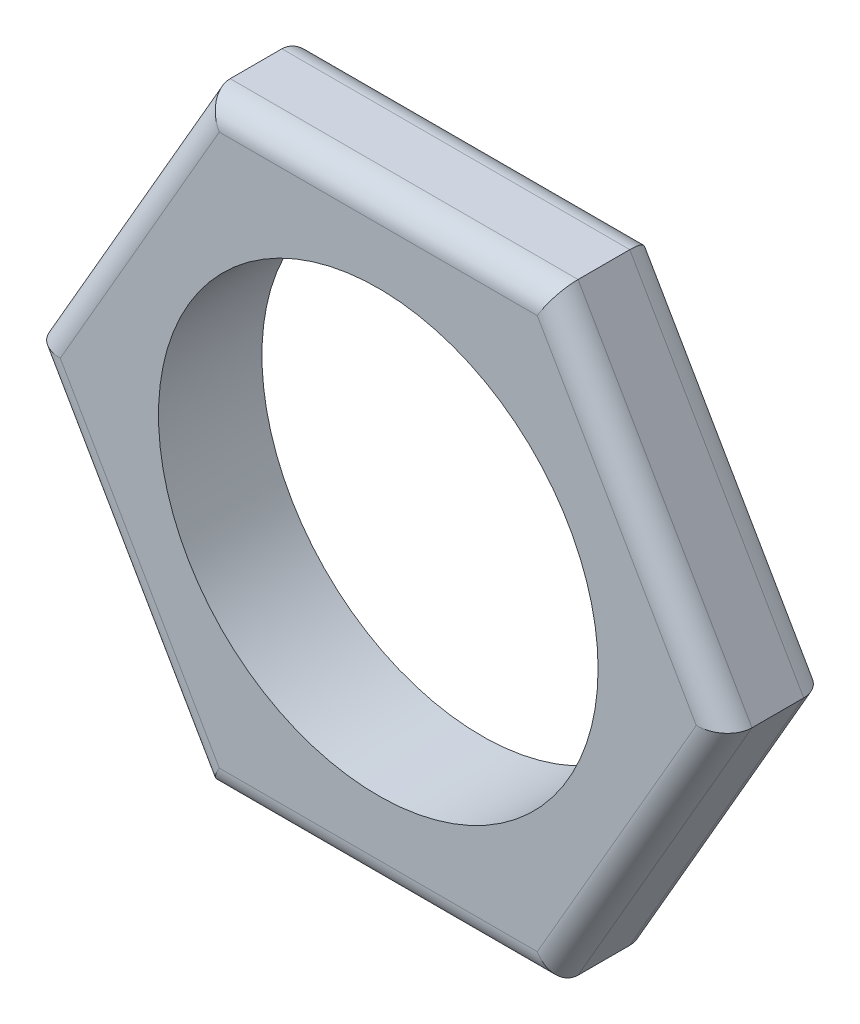
ISO-10303-21;
HEADER;
FILE_DESCRIPTION(('STEP AP214'),'2;1');
FILE_NAME('part.step','',(''),(''),'','','');
FILE_SCHEMA(('AUTOMOTIVE_DESIGN { 1 0 10303 214 1 1 1 1 }'));
ENDSEC;
DATA;
#1=APPLICATION_CONTEXT('core data for automotive mechanical design processes');
#2=APPLICATION_PROTOCOL_DEFINITION('international standard','automotive_design',2000,#1);
#3=PRODUCT_CONTEXT('',#1,'mechanical');
#4=PRODUCT('Part','Part','',(#3));
#5=PRODUCT_RELATED_PRODUCT_CATEGORY('part','',(#4));
#6=PRODUCT_DEFINITION_FORMATION('','',#4);
#7=PRODUCT_DEFINITION_CONTEXT('part definition',#1,'design');
#8=PRODUCT_DEFINITION('design','',#6,#7);
#9=PRODUCT_DEFINITION_SHAPE('','',#8);
#10=(LENGTH_UNIT() NAMED_UNIT(*) SI_UNIT(.MILLI.,.METRE.));
#11=(NAMED_UNIT(*) PLANE_ANGLE_UNIT() SI_UNIT($,.RADIAN.));
#12=(NAMED_UNIT(*) SI_UNIT($,.STERADIAN.) SOLID_ANGLE_UNIT());
#13=UNCERTAINTY_MEASURE_WITH_UNIT(LENGTH_MEASURE(1.E-05),#10,'distance_accuracy_value','');
#14=(GEOMETRIC_REPRESENTATION_CONTEXT(3) GLOBAL_UNCERTAINTY_ASSIGNED_CONTEXT((#13)) GLOBAL_UNIT_ASSIGNED_CONTEXT((#10,
#11,#12)) REPRESENTATION_CONTEXT('',''));
#15=CARTESIAN_POINT('',(0.,0.,0.));
#16=DIRECTION('',(0.,0.,1.));
#17=DIRECTION('',(1.,0.,0.));
#18=AXIS2_PLACEMENT_3D('',#15,#16,#17);
#19=CARTESIAN_POINT('',(-3.41687436311805,5.9182,2.032));
#20=DIRECTION('',(0.,0.,1.));
#21=DIRECTION('',(1.,0.,0.));
#22=AXIS2_PLACEMENT_3D('',#19,#20,#21);
#23=PLANE('',#22);
#24=DIRECTION('',(-1.,0.,0.));
#25=VECTOR('',#24,1.);
#26=CARTESIAN_POINT('',(-3.41687436311805,5.4102,2.032));
#27=LINE('',#26,#25);
#28=CARTESIAN_POINT('',(3.1235804263697,5.4102,2.032));
#29=VERTEX_POINT('',#28);
#30=CARTESIAN_POINT('',(-3.12358042636972,5.4102,2.032));
#31=VERTEX_POINT('',#30);
#32=EDGE_CURVE('E160',#29,#31,#27,.T.);
#33=ORIENTED_EDGE('',*,*,#32,.T.);
#34=DIRECTION('',(-0.499999999999998,-0.86602540378444,0.));
#35=VECTOR('',#34,1.);
#36=CARTESIAN_POINT('',(-6.3938078211136,-0.254000000000022,2.032));
#37=LINE('',#36,#35);
#38=CARTESIAN_POINT('',(-6.24716085273943,0.,2.032));
#39=VERTEX_POINT('',#38);
#40=EDGE_CURVE('E11',#31,#39,#37,.T.);
#41=ORIENTED_EDGE('',*,*,#40,.T.);
#42=DIRECTION('',(0.500000000000004,-0.866025403784436,0.));
#43=VECTOR('',#42,1.);
#44=CARTESIAN_POINT('',(-2.97693345799553,-5.6642,2.032));
#45=LINE('',#44,#43);
#46=CARTESIAN_POINT('',(-3.1235804263697,-5.4102,2.032));
#47=VERTEX_POINT('',#46);
#48=EDGE_CURVE('E42',#39,#47,#45,.T.);
#49=ORIENTED_EDGE('',*,*,#48,.T.);
#50=DIRECTION('',(1.,0.,0.));
#51=VECTOR('',#50,1.);
#52=CARTESIAN_POINT('',(3.41687436311805,-5.4102,2.032));
#53=LINE('',#52,#51);
#54=CARTESIAN_POINT('',(3.12358042636973,-5.4102,2.032));
#55=VERTEX_POINT('',#54);
#56=EDGE_CURVE('E189',#47,#55,#53,.T.);
#57=ORIENTED_EDGE('',*,*,#56,.T.);
#58=DIRECTION('',(0.499999999999998,0.86602540378444,0.));
#59=VECTOR('',#58,1.);
#60=CARTESIAN_POINT('',(6.3938078211136,0.254000000000022,2.032));
#61=LINE('',#60,#59);
#62=CARTESIAN_POINT('',(6.24716085273943,0.,2.032));
#63=VERTEX_POINT('',#62);
#64=EDGE_CURVE('E191',#55,#63,#61,.T.);
#65=ORIENTED_EDGE('',*,*,#64,.T.);
#66=DIRECTION('',(-0.500000000000004,0.866025403784436,0.));
#67=VECTOR('',#66,1.);
#68=CARTESIAN_POINT('',(2.97693345799553,5.6642,2.032));
#69=LINE('',#68,#67);
#70=EDGE_CURVE('E193',#63,#29,#69,.T.);
#71=ORIENTED_EDGE('',*,*,#70,.T.);
#72=EDGE_LOOP('',(#33,#41,#49,#57,#65,#71));
#73=FACE_BOUND('',#72,.T.);
#74=CARTESIAN_POINT('',(0.,0.,2.032));
#75=DIRECTION('',(0.,0.,1.));
#76=DIRECTION('',(1.,0.,0.));
#77=AXIS2_PLACEMENT_3D('',#74,#75,#76);
#78=CIRCLE('',#77,4.318);
#79=CARTESIAN_POINT('',(4.318,0.,2.032));
#80=VERTEX_POINT('',#79);
#81=EDGE_CURVE('E236',#80,#80,#78,.T.);
#82=ORIENTED_EDGE('',*,*,#81,.F.);
#83=EDGE_LOOP('',(#82));
#84=FACE_BOUND('',#83,.T.);
#85=ADVANCED_FACE('F33',(#73,#84),#23,.T.);
#86=CARTESIAN_POINT('',(-3.41687436311805,5.9182,0.));
#87=DIRECTION('',(0.,0.,1.));
#88=DIRECTION('',(1.,0.,0.));
#89=AXIS2_PLACEMENT_3D('',#86,#87,#88);
#90=PLANE('',#89);
#91=DIRECTION('',(-1.,0.,0.));
#92=VECTOR('',#91,1.);
#93=CARTESIAN_POINT('',(-3.41687436311805,5.4102,0.));
#94=LINE('',#93,#92);
#95=CARTESIAN_POINT('',(-3.12358042636972,5.4102,0.));
#96=VERTEX_POINT('',#95);
#97=CARTESIAN_POINT('',(3.1235804263697,5.4102,0.));
#98=VERTEX_POINT('',#97);
#99=EDGE_CURVE('E223',#96,#98,#94,.F.);
#100=ORIENTED_EDGE('',*,*,#99,.T.);
#101=DIRECTION('',(-0.500000000000004,0.866025403784436,0.));
#102=VECTOR('',#101,1.);
#103=CARTESIAN_POINT('',(1.26849627643648,8.62330000000001,0.));
#104=LINE('',#103,#102);
#105=CARTESIAN_POINT('',(6.24716085273943,0.,0.));
#106=VERTEX_POINT('',#105);
#107=EDGE_CURVE('E212',#98,#106,#104,.F.);
#108=ORIENTED_EDGE('',*,*,#107,.T.);
#109=DIRECTION('',(0.499999999999998,0.86602540378444,0.));
#110=VECTOR('',#109,1.);
#111=CARTESIAN_POINT('',(6.3938078211136,0.254000000000026,0.));
#112=LINE('',#111,#110);
#113=CARTESIAN_POINT('',(3.12358042636972,-5.4102,0.));
#114=VERTEX_POINT('',#113);
#115=EDGE_CURVE('E215',#106,#114,#112,.F.);
#116=ORIENTED_EDGE('',*,*,#115,.T.);
#117=DIRECTION('',(1.,0.,0.));
#118=VECTOR('',#117,1.);
#119=CARTESIAN_POINT('',(-3.41687436311805,-5.4102,0.));
#120=LINE('',#119,#118);
#121=CARTESIAN_POINT('',(-3.1235804263697,-5.4102,0.));
#122=VERTEX_POINT('',#121);
#123=EDGE_CURVE('E217',#114,#122,#120,.F.);
#124=ORIENTED_EDGE('',*,*,#123,.T.);
#125=DIRECTION('',(0.500000000000004,-0.866025403784436,0.));
#126=VECTOR('',#125,1.);
#127=CARTESIAN_POINT('',(-8.10224500267263,3.21309999999997,0.));
#128=LINE('',#127,#126);
#129=CARTESIAN_POINT('',(-6.24716085273943,0.,0.));
#130=VERTEX_POINT('',#129);
#131=EDGE_CURVE('E219',#122,#130,#128,.F.);
#132=ORIENTED_EDGE('',*,*,#131,.T.);
#133=DIRECTION('',(-0.499999999999998,-0.86602540378444,0.));
#134=VECTOR('',#133,1.);
#135=CARTESIAN_POINT('',(-2.97693345799556,5.6642,0.));
#136=LINE('',#135,#134);
#137=EDGE_CURVE('E221',#130,#96,#136,.F.);
#138=ORIENTED_EDGE('',*,*,#137,.T.);
#139=EDGE_LOOP('',(#100,#108,#116,#124,#132,#138));
#140=FACE_BOUND('',#139,.T.);
#141=CARTESIAN_POINT('',(0.,0.,0.));
#142=DIRECTION('',(0.,0.,1.));
#143=DIRECTION('',(1.,0.,0.));
#144=AXIS2_PLACEMENT_3D('',#141,#142,#143);
#145=CIRCLE('',#144,4.318);
#146=CARTESIAN_POINT('',(4.318,0.,0.));
#147=VERTEX_POINT('',#146);
#148=EDGE_CURVE('E174',#147,#147,#145,.T.);
#149=ORIENTED_EDGE('',*,*,#148,.T.);
#150=EDGE_LOOP('',(#149));
#151=FACE_BOUND('',#150,.T.);
#152=ADVANCED_FACE('F246',(#140,#151),#90,.F.);
#153=CARTESIAN_POINT('',(-5.12531154467707,2.95909999999999,2.032));
#154=DIRECTION('',(0.86602540378444,-0.499999999999998,0.));
#155=DIRECTION('',(0.499999999999998,0.86602540378444,0.));
#156=AXIS2_PLACEMENT_3D('',#153,#154,#155);
#157=PLANE('',#156);
#158=DIRECTION('',(0.,0.,-1.));
#159=VECTOR('',#158,1.);
#160=CARTESIAN_POINT('',(-3.41687436311805,5.9182,2.032));
#161=LINE('',#160,#159);
#162=CARTESIAN_POINT('',(-3.41687436311805,5.9182,1.524));
#163=VERTEX_POINT('',#162);
#164=CARTESIAN_POINT('',(-3.41687436311805,5.9182,0.508));
#165=VERTEX_POINT('',#164);
#166=EDGE_CURVE('E130',#163,#165,#161,.T.);
#167=ORIENTED_EDGE('',*,*,#166,.T.);
#168=DIRECTION('',(-0.499999999999998,-0.86602540378444,0.));
#169=VECTOR('',#168,1.);
#170=CARTESIAN_POINT('',(-5.12531154467707,2.95909999999999,0.508));
#171=LINE('',#170,#169);
#172=CARTESIAN_POINT('',(-6.83374872623609,0.,0.508));
#173=VERTEX_POINT('',#172);
#174=EDGE_CURVE('E136',#165,#173,#171,.T.);
#175=ORIENTED_EDGE('',*,*,#174,.T.);
#176=DIRECTION('',(0.,0.,-1.));
#177=VECTOR('',#176,1.);
#178=CARTESIAN_POINT('',(-6.83374872623609,0.,2.032));
#179=LINE('',#178,#177);
#180=CARTESIAN_POINT('',(-6.83374872623609,0.,1.524));
#181=VERTEX_POINT('',#180);
#182=EDGE_CURVE('E157',#181,#173,#179,.T.);
#183=ORIENTED_EDGE('',*,*,#182,.F.);
#184=DIRECTION('',(-0.499999999999998,-0.86602540378444,0.));
#185=VECTOR('',#184,1.);
#186=CARTESIAN_POINT('',(-3.41687436311805,5.9182,1.524));
#187=LINE('',#186,#185);
#188=EDGE_CURVE('E198',#181,#163,#187,.F.);
#189=ORIENTED_EDGE('',*,*,#188,.T.);
#190=EDGE_LOOP('',(#167,#175,#183,#189));
#191=FACE_BOUND('',#190,.T.);
#192=ADVANCED_FACE('F251',(#191),#157,.F.);
#193=CARTESIAN_POINT('',(-5.12531154467705,-2.95910000000002,2.032));
#194=DIRECTION('',(0.866025403784436,0.500000000000004,0.));
#195=DIRECTION('',(-0.500000000000004,0.866025403784436,0.));
#196=AXIS2_PLACEMENT_3D('',#193,#194,#195);
#197=PLANE('',#196);
#198=ORIENTED_EDGE('',*,*,#182,.T.);
#199=DIRECTION('',(0.500000000000004,-0.866025403784436,0.));
#200=VECTOR('',#199,1.);
#201=CARTESIAN_POINT('',(-5.12531154467705,-2.95910000000002,0.508));
#202=LINE('',#201,#200);
#203=CARTESIAN_POINT('',(-3.41687436311803,-5.9182,0.508));
#204=VERTEX_POINT('',#203);
#205=EDGE_CURVE('E200',#173,#204,#202,.T.);
#206=ORIENTED_EDGE('',*,*,#205,.T.);
#207=DIRECTION('',(0.,0.,-1.));
#208=VECTOR('',#207,1.);
#209=CARTESIAN_POINT('',(-3.41687436311803,-5.9182,2.032));
#210=LINE('',#209,#208);
#211=CARTESIAN_POINT('',(-3.41687436311803,-5.9182,1.524));
#212=VERTEX_POINT('',#211);
#213=EDGE_CURVE('E228',#212,#204,#210,.T.);
#214=ORIENTED_EDGE('',*,*,#213,.F.);
#215=DIRECTION('',(0.500000000000004,-0.866025403784436,0.));
#216=VECTOR('',#215,1.);
#217=CARTESIAN_POINT('',(-6.83374872623609,0.,1.524));
#218=LINE('',#217,#216);
#219=EDGE_CURVE('E202',#212,#181,#218,.F.);
#220=ORIENTED_EDGE('',*,*,#219,.T.);
#221=EDGE_LOOP('',(#198,#206,#214,#220));
#222=FACE_BOUND('',#221,.T.);
#223=ADVANCED_FACE('F267',(#222),#197,.F.);
#224=CARTESIAN_POINT('',(0.,-5.9182,2.032));
#225=DIRECTION('',(0.,1.,0.));
#226=DIRECTION('',(0.,0.,1.));
#227=AXIS2_PLACEMENT_3D('',#224,#225,#226);
#228=PLANE('',#227);
#229=ORIENTED_EDGE('',*,*,#213,.T.);
#230=DIRECTION('',(1.,0.,0.));
#231=VECTOR('',#230,1.);
#232=CARTESIAN_POINT('',(0.,-5.9182,0.508));
#233=LINE('',#232,#231);
#234=CARTESIAN_POINT('',(3.41687436311805,-5.9182,0.508));
#235=VERTEX_POINT('',#234);
#236=EDGE_CURVE('E204',#204,#235,#233,.T.);
#237=ORIENTED_EDGE('',*,*,#236,.T.);
#238=DIRECTION('',(0.,0.,-1.));
#239=VECTOR('',#238,1.);
#240=CARTESIAN_POINT('',(3.41687436311805,-5.9182,2.032));
#241=LINE('',#240,#239);
#242=CARTESIAN_POINT('',(3.41687436311805,-5.9182,1.524));
#243=VERTEX_POINT('',#242);
#244=EDGE_CURVE('E231',#243,#235,#241,.T.);
#245=ORIENTED_EDGE('',*,*,#244,.F.);
#246=DIRECTION('',(1.,0.,0.));
#247=VECTOR('',#246,1.);
#248=CARTESIAN_POINT('',(-3.41687436311803,-5.9182,1.524));
#249=LINE('',#248,#247);
#250=EDGE_CURVE('E206',#243,#212,#249,.F.);
#251=ORIENTED_EDGE('',*,*,#250,.T.);
#252=EDGE_LOOP('',(#229,#237,#245,#251));
#253=FACE_BOUND('',#252,.T.);
#254=ADVANCED_FACE('F263',(#253),#228,.F.);
#255=CARTESIAN_POINT('',(5.12531154467707,-2.95909999999999,2.032));
#256=DIRECTION('',(-0.86602540378444,0.499999999999998,0.));
#257=DIRECTION('',(-0.499999999999998,-0.86602540378444,0.));
#258=AXIS2_PLACEMENT_3D('',#255,#256,#257);
#259=PLANE('',#258);
#260=ORIENTED_EDGE('',*,*,#244,.T.);
#261=DIRECTION('',(0.499999999999998,0.86602540378444,0.));
#262=VECTOR('',#261,1.);
#263=CARTESIAN_POINT('',(5.12531154467707,-2.95909999999999,0.508));
#264=LINE('',#263,#262);
#265=CARTESIAN_POINT('',(6.83374872623609,0.,0.508));
#266=VERTEX_POINT('',#265);
#267=EDGE_CURVE('E208',#235,#266,#264,.T.);
#268=ORIENTED_EDGE('',*,*,#267,.T.);
#269=DIRECTION('',(0.,0.,-1.));
#270=VECTOR('',#269,1.);
#271=CARTESIAN_POINT('',(6.83374872623609,0.,2.032));
#272=LINE('',#271,#270);
#273=CARTESIAN_POINT('',(6.83374872623609,0.,1.524));
#274=VERTEX_POINT('',#273);
#275=EDGE_CURVE('E147',#274,#266,#272,.T.);
#276=ORIENTED_EDGE('',*,*,#275,.F.);
#277=DIRECTION('',(0.499999999999998,0.86602540378444,0.));
#278=VECTOR('',#277,1.);
#279=CARTESIAN_POINT('',(3.41687436311805,-5.9182,1.524));
#280=LINE('',#279,#278);
#281=EDGE_CURVE('E210',#274,#243,#280,.F.);
#282=ORIENTED_EDGE('',*,*,#281,.T.);
#283=EDGE_LOOP('',(#260,#268,#276,#282));
#284=FACE_BOUND('',#283,.T.);
#285=ADVANCED_FACE('F260',(#284),#259,.F.);
#286=CARTESIAN_POINT('',(5.12531154467705,2.95910000000002,2.032));
#287=DIRECTION('',(-0.866025403784436,-0.500000000000004,0.));
#288=DIRECTION('',(0.500000000000004,-0.866025403784436,0.));
#289=AXIS2_PLACEMENT_3D('',#286,#287,#288);
#290=PLANE('',#289);
#291=ORIENTED_EDGE('',*,*,#275,.T.);
#292=DIRECTION('',(-0.500000000000004,0.866025403784436,0.));
#293=VECTOR('',#292,1.);
#294=CARTESIAN_POINT('',(5.12531154467705,2.95910000000002,0.508));
#295=LINE('',#294,#293);
#296=CARTESIAN_POINT('',(3.41687436311803,5.9182,0.508));
#297=VERTEX_POINT('',#296);
#298=EDGE_CURVE('E146',#266,#297,#295,.T.);
#299=ORIENTED_EDGE('',*,*,#298,.T.);
#300=DIRECTION('',(0.,0.,-1.));
#301=VECTOR('',#300,1.);
#302=CARTESIAN_POINT('',(3.41687436311803,5.9182,2.032));
#303=LINE('',#302,#301);
#304=CARTESIAN_POINT('',(3.41687436311803,5.9182,1.524));
#305=VERTEX_POINT('',#304);
#306=EDGE_CURVE('E128',#305,#297,#303,.T.);
#307=ORIENTED_EDGE('',*,*,#306,.F.);
#308=DIRECTION('',(-0.500000000000004,0.866025403784436,0.));
#309=VECTOR('',#308,1.);
#310=CARTESIAN_POINT('',(6.83374872623609,0.,1.524));
#311=LINE('',#310,#309);
#312=EDGE_CURVE('E143',#305,#274,#311,.F.);
#313=ORIENTED_EDGE('',*,*,#312,.T.);
#314=EDGE_LOOP('',(#291,#299,#307,#313));
#315=FACE_BOUND('',#314,.T.);
#316=ADVANCED_FACE('F142',(#315),#290,.F.);
#317=CARTESIAN_POINT('',(0.,5.9182,2.032));
#318=DIRECTION('',(0.,-1.,0.));
#319=DIRECTION('',(0.,0.,-1.));
#320=AXIS2_PLACEMENT_3D('',#317,#318,#319);
#321=PLANE('',#320);
#322=ORIENTED_EDGE('',*,*,#306,.T.);
#323=DIRECTION('',(-1.,0.,0.));
#324=VECTOR('',#323,1.);
#325=CARTESIAN_POINT('',(0.,5.9182,0.508));
#326=LINE('',#325,#324);
#327=EDGE_CURVE('E135',#297,#165,#326,.T.);
#328=ORIENTED_EDGE('',*,*,#327,.T.);
#329=ORIENTED_EDGE('',*,*,#166,.F.);
#330=DIRECTION('',(-1.,0.,0.));
#331=VECTOR('',#330,1.);
#332=CARTESIAN_POINT('',(3.41687436311803,5.9182,1.524));
#333=LINE('',#332,#331);
#334=EDGE_CURVE('E125',#163,#305,#333,.F.);
#335=ORIENTED_EDGE('',*,*,#334,.T.);
#336=EDGE_LOOP('',(#322,#328,#329,#335));
#337=FACE_BOUND('',#336,.T.);
#338=ADVANCED_FACE('F127',(#337),#321,.F.);
#339=CARTESIAN_POINT('',(0.,0.,2.032));
#340=DIRECTION('',(0.,0.,-1.));
#341=DIRECTION('',(-1.,0.,0.));
#342=AXIS2_PLACEMENT_3D('',#339,#340,#341);
#343=CYLINDRICAL_SURFACE('',#342,4.318);
#344=ORIENTED_EDGE('',*,*,#81,.T.);
#345=EDGE_LOOP('',(#344));
#346=FACE_BOUND('',#345,.T.);
#347=ORIENTED_EDGE('',*,*,#148,.F.);
#348=EDGE_LOOP('',(#347));
#349=FACE_BOUND('',#348,.T.);
#350=ADVANCED_FACE('F242',(#346,#349),#343,.F.);
#351=CARTESIAN_POINT('',(-4.68537063955456,-2.70510000000002,0.508));
#352=DIRECTION('',(0.500000000000004,-0.866025403784436,0.));
#353=DIRECTION('',(0.866025403784436,0.500000000000004,0.));
#354=AXIS2_PLACEMENT_3D('',#351,#352,#353);
#355=CYLINDRICAL_SURFACE('',#354,0.508);
#356=CARTESIAN_POINT('',(-6.24716085273943,0.,0.508));
#357=DIRECTION('',(0.,-1.,0.));
#358=DIRECTION('',(-1.,0.,0.));
#359=AXIS2_PLACEMENT_3D('',#356,#357,#358);
#360=ELLIPSE('',#359,0.58658787349666,0.508);
#361=EDGE_CURVE('E175',#130,#173,#360,.F.);
#362=ORIENTED_EDGE('',*,*,#361,.F.);
#363=ORIENTED_EDGE('',*,*,#131,.F.);
#364=CARTESIAN_POINT('',(-3.1235804263697,-5.4102,0.508));
#365=DIRECTION('',(0.86602540378444,-0.499999999999998,0.));
#366=DIRECTION('',(-0.499999999999998,-0.86602540378444,0.));
#367=AXIS2_PLACEMENT_3D('',#364,#365,#366);
#368=ELLIPSE('',#367,0.586587873496659,0.508);
#369=EDGE_CURVE('E171',#204,#122,#368,.T.);
#370=ORIENTED_EDGE('',*,*,#369,.F.);
#371=ORIENTED_EDGE('',*,*,#205,.F.);
#372=EDGE_LOOP('',(#362,#363,#370,#371));
#373=FACE_BOUND('',#372,.T.);
#374=ADVANCED_FACE('F294',(#373),#355,.T.);
#375=CARTESIAN_POINT('',(0.,-5.4102,0.508));
#376=DIRECTION('',(1.,0.,0.));
#377=DIRECTION('',(0.,0.,-1.));
#378=AXIS2_PLACEMENT_3D('',#375,#376,#377);
#379=CYLINDRICAL_SURFACE('',#378,0.508);
#380=ORIENTED_EDGE('',*,*,#369,.T.);
#381=ORIENTED_EDGE('',*,*,#123,.F.);
#382=CARTESIAN_POINT('',(3.12358042636972,-5.4102,0.508));
#383=DIRECTION('',(0.866025403784438,0.500000000000001,0.));
#384=DIRECTION('',(0.500000000000001,-0.866025403784438,0.));
#385=AXIS2_PLACEMENT_3D('',#382,#383,#384);
#386=ELLIPSE('',#385,0.58658787349666,0.508);
#387=EDGE_CURVE('E178',#235,#114,#386,.T.);
#388=ORIENTED_EDGE('',*,*,#387,.F.);
#389=ORIENTED_EDGE('',*,*,#236,.F.);
#390=EDGE_LOOP('',(#380,#381,#388,#389));
#391=FACE_BOUND('',#390,.T.);
#392=ADVANCED_FACE('F290',(#391),#379,.T.);
#393=CARTESIAN_POINT('',(-4.68537063955458,2.70509999999999,0.508));
#394=DIRECTION('',(-0.499999999999998,-0.86602540378444,0.));
#395=DIRECTION('',(0.86602540378444,-0.499999999999998,0.));
#396=AXIS2_PLACEMENT_3D('',#393,#394,#395);
#397=CYLINDRICAL_SURFACE('',#396,0.508);
#398=ORIENTED_EDGE('',*,*,#361,.T.);
#399=ORIENTED_EDGE('',*,*,#174,.F.);
#400=CARTESIAN_POINT('',(-3.12358042636972,5.4102,0.508));
#401=DIRECTION('',(-0.866025403784438,-0.500000000000001,0.));
#402=DIRECTION('',(-0.500000000000001,0.866025403784438,0.));
#403=AXIS2_PLACEMENT_3D('',#400,#401,#402);
#404=ELLIPSE('',#403,0.58658787349666,0.508);
#405=EDGE_CURVE('E181',#96,#165,#404,.F.);
#406=ORIENTED_EDGE('',*,*,#405,.F.);
#407=ORIENTED_EDGE('',*,*,#137,.F.);
#408=EDGE_LOOP('',(#398,#399,#406,#407));
#409=FACE_BOUND('',#408,.T.);
#410=ADVANCED_FACE('F286',(#409),#397,.T.);
#411=CARTESIAN_POINT('',(4.68537063955458,-2.70509999999999,0.508));
#412=DIRECTION('',(0.499999999999998,0.86602540378444,0.));
#413=DIRECTION('',(-0.86602540378444,0.499999999999998,0.));
#414=AXIS2_PLACEMENT_3D('',#411,#412,#413);
#415=CYLINDRICAL_SURFACE('',#414,0.508);
#416=ORIENTED_EDGE('',*,*,#387,.T.);
#417=ORIENTED_EDGE('',*,*,#115,.F.);
#418=CARTESIAN_POINT('',(6.24716085273943,0.,0.508));
#419=DIRECTION('',(0.,1.,0.));
#420=DIRECTION('',(1.,0.,0.));
#421=AXIS2_PLACEMENT_3D('',#418,#419,#420);
#422=ELLIPSE('',#421,0.58658787349666,0.508);
#423=EDGE_CURVE('E184',#266,#106,#422,.T.);
#424=ORIENTED_EDGE('',*,*,#423,.F.);
#425=ORIENTED_EDGE('',*,*,#267,.F.);
#426=EDGE_LOOP('',(#416,#417,#424,#425));
#427=FACE_BOUND('',#426,.T.);
#428=ADVANCED_FACE('F282',(#427),#415,.T.);
#429=CARTESIAN_POINT('',(0.,5.4102,0.508));
#430=DIRECTION('',(-1.,0.,0.));
#431=DIRECTION('',(0.,0.,1.));
#432=AXIS2_PLACEMENT_3D('',#429,#430,#431);
#433=CYLINDRICAL_SURFACE('',#432,0.508);
#434=ORIENTED_EDGE('',*,*,#405,.T.);
#435=ORIENTED_EDGE('',*,*,#327,.F.);
#436=CARTESIAN_POINT('',(3.1235804263697,5.4102,0.508));
#437=DIRECTION('',(-0.86602540378444,0.499999999999998,0.));
#438=DIRECTION('',(-0.499999999999998,-0.86602540378444,0.));
#439=AXIS2_PLACEMENT_3D('',#436,#437,#438);
#440=ELLIPSE('',#439,0.586587873496659,0.508);
#441=EDGE_CURVE('E186',#98,#297,#440,.F.);
#442=ORIENTED_EDGE('',*,*,#441,.F.);
#443=ORIENTED_EDGE('',*,*,#99,.F.);
#444=EDGE_LOOP('',(#434,#435,#442,#443));
#445=FACE_BOUND('',#444,.T.);
#446=ADVANCED_FACE('F278',(#445),#433,.T.);
#447=CARTESIAN_POINT('',(4.68537063955456,2.70510000000002,0.508));
#448=DIRECTION('',(-0.500000000000004,0.866025403784436,0.));
#449=DIRECTION('',(-0.866025403784436,-0.500000000000004,0.));
#450=AXIS2_PLACEMENT_3D('',#447,#448,#449);
#451=CYLINDRICAL_SURFACE('',#450,0.508);
#452=ORIENTED_EDGE('',*,*,#423,.T.);
#453=ORIENTED_EDGE('',*,*,#107,.F.);
#454=ORIENTED_EDGE('',*,*,#441,.T.);
#455=ORIENTED_EDGE('',*,*,#298,.F.);
#456=EDGE_LOOP('',(#452,#453,#454,#455));
#457=FACE_BOUND('',#456,.T.);
#458=ADVANCED_FACE('F275',(#457),#451,.T.);
#459=CARTESIAN_POINT('',(6.3938078211136,0.254000000000024,1.524));
#460=DIRECTION('',(-0.499999999999998,-0.86602540378444,0.));
#461=DIRECTION('',(0.86602540378444,-0.499999999999998,0.));
#462=AXIS2_PLACEMENT_3D('',#459,#460,#461);
#463=CYLINDRICAL_SURFACE('',#462,0.508);
#464=CARTESIAN_POINT('',(3.12358042636972,-5.4102,1.524));
#465=DIRECTION('',(-0.866025403784438,-0.500000000000001,0.));
#466=DIRECTION('',(0.500000000000001,-0.866025403784438,0.));
#467=AXIS2_PLACEMENT_3D('',#464,#465,#466);
#468=ELLIPSE('',#467,0.58658787349666,0.508);
#469=EDGE_CURVE('E161',#243,#55,#468,.T.);
#470=ORIENTED_EDGE('',*,*,#469,.F.);
#471=ORIENTED_EDGE('',*,*,#281,.F.);
#472=CARTESIAN_POINT('',(6.24716085273943,0.,1.524));
#473=DIRECTION('',(0.,-1.,0.));
#474=DIRECTION('',(1.,0.,0.));
#475=AXIS2_PLACEMENT_3D('',#472,#473,#474);
#476=ELLIPSE('',#475,0.58658787349666,0.508);
#477=EDGE_CURVE('E37',#63,#274,#476,.F.);
#478=ORIENTED_EDGE('',*,*,#477,.F.);
#479=ORIENTED_EDGE('',*,*,#64,.F.);
#480=EDGE_LOOP('',(#470,#471,#478,#479));
#481=FACE_BOUND('',#480,.T.);
#482=ADVANCED_FACE('F35',(#481),#463,.T.);
#483=CARTESIAN_POINT('',(1.26849627643649,8.62330000000001,1.524));
#484=DIRECTION('',(0.500000000000004,-0.866025403784436,0.));
#485=DIRECTION('',(0.866025403784436,0.500000000000004,0.));
#486=AXIS2_PLACEMENT_3D('',#483,#484,#485);
#487=CYLINDRICAL_SURFACE('',#486,0.508);
#488=ORIENTED_EDGE('',*,*,#477,.T.);
#489=ORIENTED_EDGE('',*,*,#312,.F.);
#490=CARTESIAN_POINT('',(3.1235804263697,5.4102,1.524));
#491=DIRECTION('',(0.86602540378444,-0.499999999999998,0.));
#492=DIRECTION('',(0.499999999999998,0.86602540378444,0.));
#493=AXIS2_PLACEMENT_3D('',#490,#491,#492);
#494=ELLIPSE('',#493,0.586587873496659,0.508);
#495=EDGE_CURVE('E154',#29,#305,#494,.F.);
#496=ORIENTED_EDGE('',*,*,#495,.F.);
#497=ORIENTED_EDGE('',*,*,#70,.F.);
#498=EDGE_LOOP('',(#488,#489,#496,#497));
#499=FACE_BOUND('',#498,.T.);
#500=ADVANCED_FACE('F152',(#499),#487,.T.);
#501=CARTESIAN_POINT('',(-3.41687436311805,-5.4102,1.524));
#502=DIRECTION('',(-1.,0.,0.));
#503=DIRECTION('',(0.,0.,1.));
#504=AXIS2_PLACEMENT_3D('',#501,#502,#503);
#505=CYLINDRICAL_SURFACE('',#504,0.508);
#506=ORIENTED_EDGE('',*,*,#469,.T.);
#507=ORIENTED_EDGE('',*,*,#56,.F.);
#508=CARTESIAN_POINT('',(-3.1235804263697,-5.4102,1.524));
#509=DIRECTION('',(-0.86602540378444,0.499999999999998,0.));
#510=DIRECTION('',(-0.499999999999998,-0.86602540378444,0.));
#511=AXIS2_PLACEMENT_3D('',#508,#509,#510);
#512=ELLIPSE('',#511,0.586587873496659,0.508);
#513=EDGE_CURVE('E162',#212,#47,#512,.T.);
#514=ORIENTED_EDGE('',*,*,#513,.F.);
#515=ORIENTED_EDGE('',*,*,#250,.F.);
#516=EDGE_LOOP('',(#506,#507,#514,#515));
#517=FACE_BOUND('',#516,.T.);
#518=ADVANCED_FACE('F308',(#517),#505,.T.);
#519=CARTESIAN_POINT('',(-3.41687436311805,5.4102,1.524));
#520=DIRECTION('',(1.,0.,0.));
#521=DIRECTION('',(0.,0.,-1.));
#522=AXIS2_PLACEMENT_3D('',#519,#520,#521);
#523=CYLINDRICAL_SURFACE('',#522,0.508);
#524=ORIENTED_EDGE('',*,*,#495,.T.);
#525=ORIENTED_EDGE('',*,*,#334,.F.);
#526=CARTESIAN_POINT('',(-3.12358042636972,5.4102,1.524));
#527=DIRECTION('',(0.866025403784438,0.500000000000001,0.));
#528=DIRECTION('',(0.500000000000001,-0.866025403784438,0.));
#529=AXIS2_PLACEMENT_3D('',#526,#527,#528);
#530=ELLIPSE('',#529,0.58658787349666,0.508);
#531=EDGE_CURVE('E166',#31,#163,#530,.F.);
#532=ORIENTED_EDGE('',*,*,#531,.F.);
#533=ORIENTED_EDGE('',*,*,#32,.F.);
#534=EDGE_LOOP('',(#524,#525,#532,#533));
#535=FACE_BOUND('',#534,.T.);
#536=ADVANCED_FACE('F159',(#535),#523,.T.);
#537=CARTESIAN_POINT('',(-8.10224500267263,3.21309999999997,1.524));
#538=DIRECTION('',(-0.500000000000004,0.866025403784436,0.));
#539=DIRECTION('',(-0.866025403784436,-0.500000000000004,0.));
#540=AXIS2_PLACEMENT_3D('',#537,#538,#539);
#541=CYLINDRICAL_SURFACE('',#540,0.508);
#542=ORIENTED_EDGE('',*,*,#513,.T.);
#543=ORIENTED_EDGE('',*,*,#48,.F.);
#544=CARTESIAN_POINT('',(-6.24716085273943,0.,1.524));
#545=DIRECTION('',(0.,1.,0.));
#546=DIRECTION('',(-1.,0.,0.));
#547=AXIS2_PLACEMENT_3D('',#544,#545,#546);
#548=ELLIPSE('',#547,0.58658787349666,0.508);
#549=EDGE_CURVE('E50',#181,#39,#548,.T.);
#550=ORIENTED_EDGE('',*,*,#549,.F.);
#551=ORIENTED_EDGE('',*,*,#219,.F.);
#552=EDGE_LOOP('',(#542,#543,#550,#551));
#553=FACE_BOUND('',#552,.T.);
#554=ADVANCED_FACE('F302',(#553),#541,.T.);
#555=CARTESIAN_POINT('',(-2.97693345799556,5.6642,1.524));
#556=DIRECTION('',(0.499999999999998,0.86602540378444,0.));
#557=DIRECTION('',(-0.86602540378444,0.499999999999998,0.));
#558=AXIS2_PLACEMENT_3D('',#555,#556,#557);
#559=CYLINDRICAL_SURFACE('',#558,0.508);
#560=ORIENTED_EDGE('',*,*,#531,.T.);
#561=ORIENTED_EDGE('',*,*,#188,.F.);
#562=ORIENTED_EDGE('',*,*,#549,.T.);
#563=ORIENTED_EDGE('',*,*,#40,.F.);
#564=EDGE_LOOP('',(#560,#561,#562,#563));
#565=FACE_BOUND('',#564,.T.);
#566=ADVANCED_FACE('F299',(#565),#559,.T.);
#567=CLOSED_SHELL('',(#85,#152,#192,#223,#254,#285,#316,#338,#350,#374,#392,#410,#428,#446,#458,
#482,#500,#518,#536,#554,#566));
#568=MANIFOLD_SOLID_BREP('B2',#567);
#569=ADVANCED_BREP_SHAPE_REPRESENTATION('',(#18,#568),#14);
#570=SHAPE_DEFINITION_REPRESENTATION(#9,#569);
ENDSEC;
END-ISO-10303-21;
